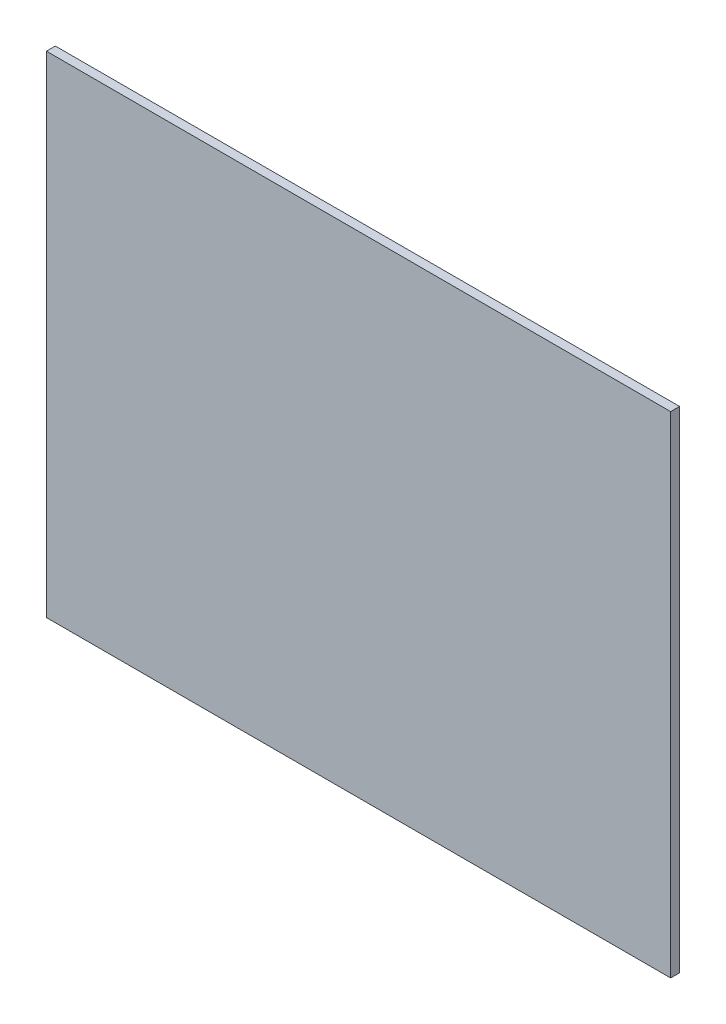
ISO-10303-21;
HEADER;
FILE_DESCRIPTION(('STEP AP214'),'2;1');
FILE_NAME('part.step','',(''),(''),'','','');
FILE_SCHEMA(('AUTOMOTIVE_DESIGN { 1 0 10303 214 1 1 1 1 }'));
ENDSEC;
DATA;
#1=APPLICATION_CONTEXT('core data for automotive mechanical design processes');
#2=APPLICATION_PROTOCOL_DEFINITION('international standard','automotive_design',2000,#1);
#3=PRODUCT_CONTEXT('',#1,'mechanical');
#4=PRODUCT('Part','Part','',(#3));
#5=PRODUCT_RELATED_PRODUCT_CATEGORY('part','',(#4));
#6=PRODUCT_DEFINITION_FORMATION('','',#4);
#7=PRODUCT_DEFINITION_CONTEXT('part definition',#1,'design');
#8=PRODUCT_DEFINITION('design','',#6,#7);
#9=PRODUCT_DEFINITION_SHAPE('','',#8);
#10=(LENGTH_UNIT() NAMED_UNIT(*) SI_UNIT(.MILLI.,.METRE.));
#11=(NAMED_UNIT(*) PLANE_ANGLE_UNIT() SI_UNIT($,.RADIAN.));
#12=(NAMED_UNIT(*) SI_UNIT($,.STERADIAN.) SOLID_ANGLE_UNIT());
#13=UNCERTAINTY_MEASURE_WITH_UNIT(LENGTH_MEASURE(1.E-05),#10,'distance_accuracy_value','');
#14=(GEOMETRIC_REPRESENTATION_CONTEXT(3) GLOBAL_UNCERTAINTY_ASSIGNED_CONTEXT((#13)) GLOBAL_UNIT_ASSIGNED_CONTEXT((#10,
#11,#12)) REPRESENTATION_CONTEXT('',''));
#15=CARTESIAN_POINT('',(0.,0.,0.));
#16=DIRECTION('',(0.,0.,1.));
#17=DIRECTION('',(1.,0.,0.));
#18=AXIS2_PLACEMENT_3D('',#15,#16,#17);
#19=CARTESIAN_POINT('',(0.,0.,5.08));
#20=DIRECTION('',(1.,0.,0.));
#21=DIRECTION('',(0.,0.,-1.));
#22=AXIS2_PLACEMENT_3D('',#19,#20,#21);
#23=PLANE('',#22);
#24=DIRECTION('',(0.,-1.,0.));
#25=VECTOR('',#24,1.);
#26=CARTESIAN_POINT('',(0.,0.,0.));
#27=LINE('',#26,#25);
#28=CARTESIAN_POINT('',(0.,279.4,0.));
#29=VERTEX_POINT('',#28);
#30=CARTESIAN_POINT('',(0.,0.,0.));
#31=VERTEX_POINT('',#30);
#32=EDGE_CURVE('E107',#29,#31,#27,.T.);
#33=ORIENTED_EDGE('',*,*,#32,.T.);
#34=DIRECTION('',(0.,0.,-1.));
#35=VECTOR('',#34,1.);
#36=CARTESIAN_POINT('',(0.,0.,5.08));
#37=LINE('',#36,#35);
#38=CARTESIAN_POINT('',(0.,0.,5.08));
#39=VERTEX_POINT('',#38);
#40=EDGE_CURVE('E11',#39,#31,#37,.T.);
#41=ORIENTED_EDGE('',*,*,#40,.F.);
#42=DIRECTION('',(0.,-1.,0.));
#43=VECTOR('',#42,1.);
#44=CARTESIAN_POINT('',(0.,0.,5.08));
#45=LINE('',#44,#43);
#46=CARTESIAN_POINT('',(0.,279.4,5.08));
#47=VERTEX_POINT('',#46);
#48=EDGE_CURVE('E91',#47,#39,#45,.T.);
#49=ORIENTED_EDGE('',*,*,#48,.F.);
#50=DIRECTION('',(0.,0.,-1.));
#51=VECTOR('',#50,1.);
#52=CARTESIAN_POINT('',(0.,279.4,5.08));
#53=LINE('',#52,#51);
#54=EDGE_CURVE('E103',#47,#29,#53,.T.);
#55=ORIENTED_EDGE('',*,*,#54,.T.);
#56=EDGE_LOOP('',(#33,#41,#49,#55));
#57=FACE_BOUND('',#56,.T.);
#58=ADVANCED_FACE('F39',(#57),#23,.F.);
#59=CARTESIAN_POINT('',(0.,0.,5.08));
#60=DIRECTION('',(0.,1.,0.));
#61=DIRECTION('',(0.,0.,1.));
#62=AXIS2_PLACEMENT_3D('',#59,#60,#61);
#63=PLANE('',#62);
#64=DIRECTION('',(1.,0.,0.));
#65=VECTOR('',#64,1.);
#66=CARTESIAN_POINT('',(0.,0.,0.));
#67=LINE('',#66,#65);
#68=CARTESIAN_POINT('',(355.6,0.,0.));
#69=VERTEX_POINT('',#68);
#70=EDGE_CURVE('E96',#31,#69,#67,.T.);
#71=ORIENTED_EDGE('',*,*,#70,.T.);
#72=DIRECTION('',(0.,0.,-1.));
#73=VECTOR('',#72,1.);
#74=CARTESIAN_POINT('',(355.6,0.,5.08));
#75=LINE('',#74,#73);
#76=CARTESIAN_POINT('',(355.6,0.,5.08));
#77=VERTEX_POINT('',#76);
#78=EDGE_CURVE('E48',#77,#69,#75,.T.);
#79=ORIENTED_EDGE('',*,*,#78,.F.);
#80=DIRECTION('',(1.,0.,0.));
#81=VECTOR('',#80,1.);
#82=CARTESIAN_POINT('',(0.,0.,5.08));
#83=LINE('',#82,#81);
#84=EDGE_CURVE('E86',#39,#77,#83,.T.);
#85=ORIENTED_EDGE('',*,*,#84,.F.);
#86=ORIENTED_EDGE('',*,*,#40,.T.);
#87=EDGE_LOOP('',(#71,#79,#85,#86));
#88=FACE_BOUND('',#87,.T.);
#89=ADVANCED_FACE('F95',(#88),#63,.F.);
#90=CARTESIAN_POINT('',(355.6,0.,5.08));
#91=DIRECTION('',(-1.,0.,0.));
#92=DIRECTION('',(0.,0.,1.));
#93=AXIS2_PLACEMENT_3D('',#90,#91,#92);
#94=PLANE('',#93);
#95=DIRECTION('',(0.,1.,0.));
#96=VECTOR('',#95,1.);
#97=CARTESIAN_POINT('',(355.6,0.,0.));
#98=LINE('',#97,#96);
#99=CARTESIAN_POINT('',(355.6,279.4,0.));
#100=VERTEX_POINT('',#99);
#101=EDGE_CURVE('E73',#69,#100,#98,.T.);
#102=ORIENTED_EDGE('',*,*,#101,.T.);
#103=DIRECTION('',(0.,0.,-1.));
#104=VECTOR('',#103,1.);
#105=CARTESIAN_POINT('',(355.6,279.4,5.08));
#106=LINE('',#105,#104);
#107=CARTESIAN_POINT('',(355.6,279.4,5.08));
#108=VERTEX_POINT('',#107);
#109=EDGE_CURVE('E98',#108,#100,#106,.T.);
#110=ORIENTED_EDGE('',*,*,#109,.F.);
#111=DIRECTION('',(0.,1.,0.));
#112=VECTOR('',#111,1.);
#113=CARTESIAN_POINT('',(355.6,0.,5.08));
#114=LINE('',#113,#112);
#115=EDGE_CURVE('E89',#77,#108,#114,.T.);
#116=ORIENTED_EDGE('',*,*,#115,.F.);
#117=ORIENTED_EDGE('',*,*,#78,.T.);
#118=EDGE_LOOP('',(#102,#110,#116,#117));
#119=FACE_BOUND('',#118,.T.);
#120=ADVANCED_FACE('F99',(#119),#94,.F.);
#121=CARTESIAN_POINT('',(0.,279.4,5.08));
#122=DIRECTION('',(0.,-1.,0.));
#123=DIRECTION('',(0.,0.,-1.));
#124=AXIS2_PLACEMENT_3D('',#121,#122,#123);
#125=PLANE('',#124);
#126=DIRECTION('',(-1.,0.,0.));
#127=VECTOR('',#126,1.);
#128=CARTESIAN_POINT('',(0.,279.4,0.));
#129=LINE('',#128,#127);
#130=EDGE_CURVE('E79',#100,#29,#129,.T.);
#131=ORIENTED_EDGE('',*,*,#130,.T.);
#132=ORIENTED_EDGE('',*,*,#54,.F.);
#133=DIRECTION('',(-1.,0.,0.));
#134=VECTOR('',#133,1.);
#135=CARTESIAN_POINT('',(0.,279.4,5.08));
#136=LINE('',#135,#134);
#137=EDGE_CURVE('E56',#108,#47,#136,.T.);
#138=ORIENTED_EDGE('',*,*,#137,.F.);
#139=ORIENTED_EDGE('',*,*,#109,.T.);
#140=EDGE_LOOP('',(#131,#132,#138,#139));
#141=FACE_BOUND('',#140,.T.);
#142=ADVANCED_FACE('F120',(#141),#125,.F.);
#143=CARTESIAN_POINT('',(0.,0.,5.08));
#144=DIRECTION('',(0.,0.,-1.));
#145=DIRECTION('',(-1.,0.,0.));
#146=AXIS2_PLACEMENT_3D('',#143,#144,#145);
#147=PLANE('',#146);
#148=ORIENTED_EDGE('',*,*,#48,.T.);
#149=ORIENTED_EDGE('',*,*,#84,.T.);
#150=ORIENTED_EDGE('',*,*,#115,.T.);
#151=ORIENTED_EDGE('',*,*,#137,.T.);
#152=EDGE_LOOP('',(#148,#149,#150,#151));
#153=FACE_BOUND('',#152,.T.);
#154=ADVANCED_FACE('F87',(#153),#147,.F.);
#155=CARTESIAN_POINT('',(0.,0.,0.));
#156=DIRECTION('',(0.,0.,-1.));
#157=DIRECTION('',(-1.,0.,0.));
#158=AXIS2_PLACEMENT_3D('',#155,#156,#157);
#159=PLANE('',#158);
#160=ORIENTED_EDGE('',*,*,#32,.F.);
#161=ORIENTED_EDGE('',*,*,#130,.F.);
#162=ORIENTED_EDGE('',*,*,#101,.F.);
#163=ORIENTED_EDGE('',*,*,#70,.F.);
#164=EDGE_LOOP('',(#160,#161,#162,#163));
#165=FACE_BOUND('',#164,.T.);
#166=ADVANCED_FACE('F123',(#165),#159,.T.);
#167=CLOSED_SHELL('',(#58,#89,#120,#142,#154,#166));
#168=MANIFOLD_SOLID_BREP('B2',#167);
#169=ADVANCED_BREP_SHAPE_REPRESENTATION('',(#18,#168),#14);
#170=SHAPE_DEFINITION_REPRESENTATION(#9,#169);
ENDSEC;
END-ISO-10303-21;
